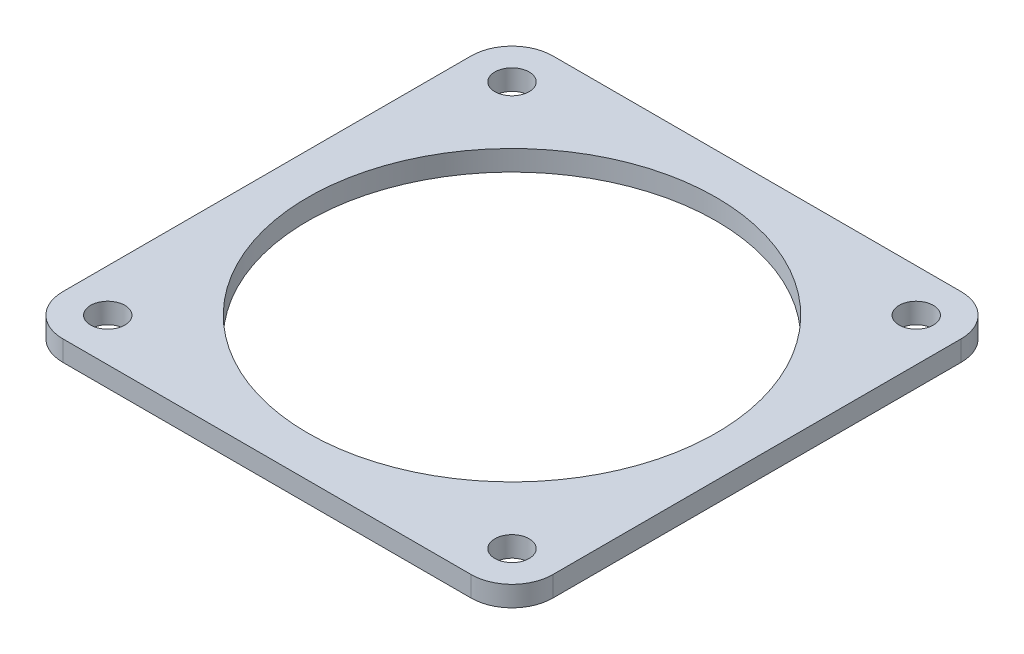
ISO-10303-21;
HEADER;
FILE_DESCRIPTION(('STEP AP214'),'2;1');
FILE_NAME('part.step','',(''),(''),'','','');
FILE_SCHEMA(('AUTOMOTIVE_DESIGN { 1 0 10303 214 1 1 1 1 }'));
ENDSEC;
DATA;
#1=APPLICATION_CONTEXT('core data for automotive mechanical design processes');
#2=APPLICATION_PROTOCOL_DEFINITION('international standard','automotive_design',2000,#1);
#3=PRODUCT_CONTEXT('',#1,'mechanical');
#4=PRODUCT('Part','Part','',(#3));
#5=PRODUCT_RELATED_PRODUCT_CATEGORY('part','',(#4));
#6=PRODUCT_DEFINITION_FORMATION('','',#4);
#7=PRODUCT_DEFINITION_CONTEXT('part definition',#1,'design');
#8=PRODUCT_DEFINITION('design','',#6,#7);
#9=PRODUCT_DEFINITION_SHAPE('','',#8);
#10=(LENGTH_UNIT() NAMED_UNIT(*) SI_UNIT(.MILLI.,.METRE.));
#11=(NAMED_UNIT(*) PLANE_ANGLE_UNIT() SI_UNIT($,.RADIAN.));
#12=(NAMED_UNIT(*) SI_UNIT($,.STERADIAN.) SOLID_ANGLE_UNIT());
#13=UNCERTAINTY_MEASURE_WITH_UNIT(LENGTH_MEASURE(1.E-05),#10,'distance_accuracy_value','');
#14=(GEOMETRIC_REPRESENTATION_CONTEXT(3) GLOBAL_UNCERTAINTY_ASSIGNED_CONTEXT((#13)) GLOBAL_UNIT_ASSIGNED_CONTEXT((#10,
#11,#12)) REPRESENTATION_CONTEXT('',''));
#15=CARTESIAN_POINT('',(0.,0.,0.));
#16=DIRECTION('',(0.,0.,1.));
#17=DIRECTION('',(1.,0.,0.));
#18=AXIS2_PLACEMENT_3D('',#15,#16,#17);
#19=CARTESIAN_POINT('',(0.,3.175,0.));
#20=DIRECTION('',(0.,1.,0.));
#21=DIRECTION('',(0.,0.,1.));
#22=AXIS2_PLACEMENT_3D('',#19,#20,#21);
#23=PLANE('',#22);
#24=CARTESIAN_POINT('',(31.4308964237419,3.175,31.4308964237421));
#25=DIRECTION('',(0.,1.,0.));
#26=DIRECTION('',(-1.,0.,0.));
#27=AXIS2_PLACEMENT_3D('',#24,#25,#26);
#28=CIRCLE('',#27,2.665);
#29=CARTESIAN_POINT('',(28.7658964237419,3.175,31.4308964237421));
#30=VERTEX_POINT('',#29);
#31=EDGE_CURVE('E201',#30,#30,#28,.T.);
#32=ORIENTED_EDGE('',*,*,#31,.F.);
#33=EDGE_LOOP('',(#32));
#34=FACE_BOUND('',#33,.T.);
#35=CARTESIAN_POINT('',(-31.430896423742,3.175,31.430896423742));
#36=DIRECTION('',(0.,1.,0.));
#37=DIRECTION('',(0.,0.,-1.));
#38=AXIS2_PLACEMENT_3D('',#35,#36,#37);
#39=CIRCLE('',#38,2.665);
#40=CARTESIAN_POINT('',(-31.430896423742,3.175,28.765896423742));
#41=VERTEX_POINT('',#40);
#42=EDGE_CURVE('E194',#41,#41,#39,.T.);
#43=ORIENTED_EDGE('',*,*,#42,.F.);
#44=EDGE_LOOP('',(#43));
#45=FACE_BOUND('',#44,.T.);
#46=CARTESIAN_POINT('',(-31.4308964237417,3.175,-31.4308964237424));
#47=DIRECTION('',(0.,1.,0.));
#48=DIRECTION('',(1.,0.,0.));
#49=AXIS2_PLACEMENT_3D('',#46,#47,#48);
#50=CIRCLE('',#49,2.665);
#51=CARTESIAN_POINT('',(-28.7658964237417,3.175,-31.4308964237423));
#52=VERTEX_POINT('',#51);
#53=EDGE_CURVE('E195',#52,#52,#50,.T.);
#54=ORIENTED_EDGE('',*,*,#53,.F.);
#55=EDGE_LOOP('',(#54));
#56=FACE_BOUND('',#55,.T.);
#57=CARTESIAN_POINT('',(31.430896423742,3.175,-31.430896423742));
#58=DIRECTION('',(0.,1.,0.));
#59=DIRECTION('',(0.,0.,1.));
#60=AXIS2_PLACEMENT_3D('',#57,#58,#59);
#61=CIRCLE('',#60,2.665);
#62=CARTESIAN_POINT('',(31.430896423742,3.175,-28.765896423742));
#63=VERTEX_POINT('',#62);
#64=EDGE_CURVE('E187',#63,#63,#61,.T.);
#65=ORIENTED_EDGE('',*,*,#64,.F.);
#66=EDGE_LOOP('',(#65));
#67=FACE_BOUND('',#66,.T.);
#68=DIRECTION('',(-1.,0.,0.));
#69=VECTOR('',#68,1.);
#70=CARTESIAN_POINT('',(-38.1,3.175,-38.1));
#71=LINE('',#70,#69);
#72=CARTESIAN_POINT('',(31.75,3.175,-38.1));
#73=VERTEX_POINT('',#72);
#74=CARTESIAN_POINT('',(-31.75,3.175,-38.1));
#75=VERTEX_POINT('',#74);
#76=EDGE_CURVE('E169',#73,#75,#71,.T.);
#77=ORIENTED_EDGE('',*,*,#76,.T.);
#78=CARTESIAN_POINT('',(-31.75,3.175,-31.75));
#79=DIRECTION('',(0.,1.,0.));
#80=DIRECTION('',(0.,0.,1.));
#81=AXIS2_PLACEMENT_3D('',#78,#79,#80);
#82=CIRCLE('',#81,6.35);
#83=CARTESIAN_POINT('',(-38.1,3.175,-31.75));
#84=VERTEX_POINT('',#83);
#85=EDGE_CURVE('E147',#75,#84,#82,.T.);
#86=ORIENTED_EDGE('',*,*,#85,.T.);
#87=DIRECTION('',(0.,0.,1.));
#88=VECTOR('',#87,1.);
#89=CARTESIAN_POINT('',(-38.1,3.175,-38.1));
#90=LINE('',#89,#88);
#91=CARTESIAN_POINT('',(-38.1,3.175,31.75));
#92=VERTEX_POINT('',#91);
#93=EDGE_CURVE('E117',#84,#92,#90,.T.);
#94=ORIENTED_EDGE('',*,*,#93,.T.);
#95=CARTESIAN_POINT('',(-31.75,3.175,31.75));
#96=DIRECTION('',(0.,1.,0.));
#97=DIRECTION('',(0.,0.,1.));
#98=AXIS2_PLACEMENT_3D('',#95,#96,#97);
#99=CIRCLE('',#98,6.35);
#100=CARTESIAN_POINT('',(-31.75,3.175,38.1));
#101=VERTEX_POINT('',#100);
#102=EDGE_CURVE('E53',#92,#101,#99,.T.);
#103=ORIENTED_EDGE('',*,*,#102,.T.);
#104=DIRECTION('',(1.,0.,0.));
#105=VECTOR('',#104,1.);
#106=CARTESIAN_POINT('',(-38.1,3.175,38.1));
#107=LINE('',#106,#105);
#108=CARTESIAN_POINT('',(31.75,3.175,38.1));
#109=VERTEX_POINT('',#108);
#110=EDGE_CURVE('E133',#101,#109,#107,.T.);
#111=ORIENTED_EDGE('',*,*,#110,.T.);
#112=CARTESIAN_POINT('',(31.75,3.175,31.75));
#113=DIRECTION('',(0.,1.,0.));
#114=DIRECTION('',(0.,0.,1.));
#115=AXIS2_PLACEMENT_3D('',#112,#113,#114);
#116=CIRCLE('',#115,6.35);
#117=CARTESIAN_POINT('',(38.1,3.175,31.75));
#118=VERTEX_POINT('',#117);
#119=EDGE_CURVE('E143',#109,#118,#116,.T.);
#120=ORIENTED_EDGE('',*,*,#119,.T.);
#121=DIRECTION('',(0.,0.,-1.));
#122=VECTOR('',#121,1.);
#123=CARTESIAN_POINT('',(38.1,3.175,-38.1));
#124=LINE('',#123,#122);
#125=CARTESIAN_POINT('',(38.1,3.175,-31.75));
#126=VERTEX_POINT('',#125);
#127=EDGE_CURVE('E127',#118,#126,#124,.T.);
#128=ORIENTED_EDGE('',*,*,#127,.T.);
#129=CARTESIAN_POINT('',(31.75,3.175,-31.75));
#130=DIRECTION('',(0.,1.,0.));
#131=DIRECTION('',(0.,0.,1.));
#132=AXIS2_PLACEMENT_3D('',#129,#130,#131);
#133=CIRCLE('',#132,6.35);
#134=EDGE_CURVE('E145',#126,#73,#133,.T.);
#135=ORIENTED_EDGE('',*,*,#134,.T.);
#136=EDGE_LOOP('',(#77,#86,#94,#103,#111,#120,#128,#135));
#137=FACE_BOUND('',#136,.T.);
#138=CARTESIAN_POINT('',(0.,3.175,0.));
#139=DIRECTION('',(0.,1.,0.));
#140=DIRECTION('',(0.,0.,1.));
#141=AXIS2_PLACEMENT_3D('',#138,#139,#140);
#142=CIRCLE('',#141,31.75);
#143=CARTESIAN_POINT('',(0.,3.175,31.75));
#144=VERTEX_POINT('',#143);
#145=EDGE_CURVE('E178',#144,#144,#142,.T.);
#146=ORIENTED_EDGE('',*,*,#145,.F.);
#147=EDGE_LOOP('',(#146));
#148=FACE_BOUND('',#147,.T.);
#149=ADVANCED_FACE('F33',(#34,#45,#56,#67,#137,#148),#23,.T.);
#150=CARTESIAN_POINT('',(0.,0.,0.));
#151=DIRECTION('',(0.,1.,0.));
#152=DIRECTION('',(0.,0.,1.));
#153=AXIS2_PLACEMENT_3D('',#150,#151,#152);
#154=PLANE('',#153);
#155=CARTESIAN_POINT('',(31.4308964237419,0.,31.4308964237421));
#156=DIRECTION('',(0.,1.,0.));
#157=DIRECTION('',(0.,0.,1.));
#158=AXIS2_PLACEMENT_3D('',#155,#156,#157);
#159=CIRCLE('',#158,2.665);
#160=CARTESIAN_POINT('',(31.4308964237419,0.,34.0958964237421));
#161=VERTEX_POINT('',#160);
#162=EDGE_CURVE('E190',#161,#161,#159,.F.);
#163=ORIENTED_EDGE('',*,*,#162,.F.);
#164=EDGE_LOOP('',(#163));
#165=FACE_BOUND('',#164,.T.);
#166=CARTESIAN_POINT('',(-31.430896423742,0.,31.430896423742));
#167=DIRECTION('',(0.,1.,0.));
#168=DIRECTION('',(0.,0.,1.));
#169=AXIS2_PLACEMENT_3D('',#166,#167,#168);
#170=CIRCLE('',#169,2.665);
#171=CARTESIAN_POINT('',(-31.430896423742,0.,34.095896423742));
#172=VERTEX_POINT('',#171);
#173=EDGE_CURVE('E198',#172,#172,#170,.F.);
#174=ORIENTED_EDGE('',*,*,#173,.F.);
#175=EDGE_LOOP('',(#174));
#176=FACE_BOUND('',#175,.T.);
#177=CARTESIAN_POINT('',(-31.4308964237417,0.,-31.4308964237424));
#178=DIRECTION('',(0.,1.,0.));
#179=DIRECTION('',(0.,0.,1.));
#180=AXIS2_PLACEMENT_3D('',#177,#178,#179);
#181=CIRCLE('',#180,2.665);
#182=CARTESIAN_POINT('',(-31.4308964237417,0.,-28.7658964237424));
#183=VERTEX_POINT('',#182);
#184=EDGE_CURVE('E191',#183,#183,#181,.F.);
#185=ORIENTED_EDGE('',*,*,#184,.F.);
#186=EDGE_LOOP('',(#185));
#187=FACE_BOUND('',#186,.T.);
#188=CARTESIAN_POINT('',(31.430896423742,0.,-31.430896423742));
#189=DIRECTION('',(0.,1.,0.));
#190=DIRECTION('',(0.,0.,1.));
#191=AXIS2_PLACEMENT_3D('',#188,#189,#190);
#192=CIRCLE('',#191,2.665);
#193=CARTESIAN_POINT('',(31.430896423742,0.,-28.765896423742));
#194=VERTEX_POINT('',#193);
#195=EDGE_CURVE('E183',#194,#194,#192,.F.);
#196=ORIENTED_EDGE('',*,*,#195,.F.);
#197=EDGE_LOOP('',(#196));
#198=FACE_BOUND('',#197,.T.);
#199=DIRECTION('',(0.,0.,1.));
#200=VECTOR('',#199,1.);
#201=CARTESIAN_POINT('',(-38.1,0.,-38.1));
#202=LINE('',#201,#200);
#203=CARTESIAN_POINT('',(-38.1,0.,-31.75));
#204=VERTEX_POINT('',#203);
#205=CARTESIAN_POINT('',(-38.1,0.,31.75));
#206=VERTEX_POINT('',#205);
#207=EDGE_CURVE('E115',#204,#206,#202,.T.);
#208=ORIENTED_EDGE('',*,*,#207,.F.);
#209=CARTESIAN_POINT('',(-31.75,0.,-31.75));
#210=DIRECTION('',(0.,1.,0.));
#211=DIRECTION('',(0.,0.,1.));
#212=AXIS2_PLACEMENT_3D('',#209,#210,#211);
#213=CIRCLE('',#212,6.35);
#214=CARTESIAN_POINT('',(-31.75,0.,-38.1));
#215=VERTEX_POINT('',#214);
#216=EDGE_CURVE('E98',#204,#215,#213,.F.);
#217=ORIENTED_EDGE('',*,*,#216,.T.);
#218=DIRECTION('',(-1.,0.,0.));
#219=VECTOR('',#218,1.);
#220=CARTESIAN_POINT('',(-38.1,0.,-38.1));
#221=LINE('',#220,#219);
#222=CARTESIAN_POINT('',(31.75,0.,-38.1));
#223=VERTEX_POINT('',#222);
#224=EDGE_CURVE('E125',#223,#215,#221,.T.);
#225=ORIENTED_EDGE('',*,*,#224,.F.);
#226=CARTESIAN_POINT('',(31.75,0.,-31.75));
#227=DIRECTION('',(0.,1.,0.));
#228=DIRECTION('',(0.,0.,1.));
#229=AXIS2_PLACEMENT_3D('',#226,#227,#228);
#230=CIRCLE('',#229,6.35);
#231=CARTESIAN_POINT('',(38.1,0.,-31.75));
#232=VERTEX_POINT('',#231);
#233=EDGE_CURVE('E109',#223,#232,#230,.F.);
#234=ORIENTED_EDGE('',*,*,#233,.T.);
#235=DIRECTION('',(0.,0.,-1.));
#236=VECTOR('',#235,1.);
#237=CARTESIAN_POINT('',(38.1,0.,-38.1));
#238=LINE('',#237,#236);
#239=CARTESIAN_POINT('',(38.1,0.,31.75));
#240=VERTEX_POINT('',#239);
#241=EDGE_CURVE('E129',#240,#232,#238,.T.);
#242=ORIENTED_EDGE('',*,*,#241,.F.);
#243=CARTESIAN_POINT('',(31.75,0.,31.75));
#244=DIRECTION('',(0.,1.,0.));
#245=DIRECTION('',(0.,0.,1.));
#246=AXIS2_PLACEMENT_3D('',#243,#244,#245);
#247=CIRCLE('',#246,6.35);
#248=CARTESIAN_POINT('',(31.75,0.,38.1));
#249=VERTEX_POINT('',#248);
#250=EDGE_CURVE('E136',#240,#249,#247,.F.);
#251=ORIENTED_EDGE('',*,*,#250,.T.);
#252=DIRECTION('',(1.,0.,0.));
#253=VECTOR('',#252,1.);
#254=CARTESIAN_POINT('',(-38.1,0.,38.1));
#255=LINE('',#254,#253);
#256=CARTESIAN_POINT('',(-31.75,0.,38.1));
#257=VERTEX_POINT('',#256);
#258=EDGE_CURVE('E124',#257,#249,#255,.T.);
#259=ORIENTED_EDGE('',*,*,#258,.F.);
#260=CARTESIAN_POINT('',(-31.75,0.,31.75));
#261=DIRECTION('',(0.,1.,0.));
#262=DIRECTION('',(0.,0.,1.));
#263=AXIS2_PLACEMENT_3D('',#260,#261,#262);
#264=CIRCLE('',#263,6.35);
#265=EDGE_CURVE('E118',#257,#206,#264,.F.);
#266=ORIENTED_EDGE('',*,*,#265,.T.);
#267=EDGE_LOOP('',(#208,#217,#225,#234,#242,#251,#259,#266));
#268=FACE_BOUND('',#267,.T.);
#269=CARTESIAN_POINT('',(0.,0.,0.));
#270=DIRECTION('',(0.,1.,0.));
#271=DIRECTION('',(0.,0.,1.));
#272=AXIS2_PLACEMENT_3D('',#269,#270,#271);
#273=CIRCLE('',#272,31.75);
#274=CARTESIAN_POINT('',(0.,0.,31.75));
#275=VERTEX_POINT('',#274);
#276=EDGE_CURVE('E174',#275,#275,#273,.T.);
#277=ORIENTED_EDGE('',*,*,#276,.T.);
#278=EDGE_LOOP('',(#277));
#279=FACE_BOUND('',#278,.T.);
#280=ADVANCED_FACE('F121',(#165,#176,#187,#198,#268,#279),#154,.F.);
#281=CARTESIAN_POINT('',(38.1,3.175,-38.1));
#282=DIRECTION('',(-1.,0.,0.));
#283=DIRECTION('',(0.,0.,1.));
#284=AXIS2_PLACEMENT_3D('',#281,#282,#283);
#285=PLANE('',#284);
#286=ORIENTED_EDGE('',*,*,#241,.T.);
#287=DIRECTION('',(0.,-1.,0.));
#288=VECTOR('',#287,1.);
#289=CARTESIAN_POINT('',(38.1,3.175,-31.75));
#290=LINE('',#289,#288);
#291=EDGE_CURVE('E152',#232,#126,#290,.F.);
#292=ORIENTED_EDGE('',*,*,#291,.T.);
#293=ORIENTED_EDGE('',*,*,#127,.F.);
#294=DIRECTION('',(0.,-1.,0.));
#295=VECTOR('',#294,1.);
#296=CARTESIAN_POINT('',(38.1,3.175,31.75));
#297=LINE('',#296,#295);
#298=EDGE_CURVE('E149',#118,#240,#297,.T.);
#299=ORIENTED_EDGE('',*,*,#298,.T.);
#300=EDGE_LOOP('',(#286,#292,#293,#299));
#301=FACE_BOUND('',#300,.T.);
#302=ADVANCED_FACE('F165',(#301),#285,.F.);
#303=CARTESIAN_POINT('',(-38.1,3.175,-38.1));
#304=DIRECTION('',(0.,0.,1.));
#305=DIRECTION('',(1.,0.,0.));
#306=AXIS2_PLACEMENT_3D('',#303,#304,#305);
#307=PLANE('',#306);
#308=ORIENTED_EDGE('',*,*,#224,.T.);
#309=DIRECTION('',(0.,-1.,0.));
#310=VECTOR('',#309,1.);
#311=CARTESIAN_POINT('',(-31.75,3.175,-38.1));
#312=LINE('',#311,#310);
#313=EDGE_CURVE('E103',#215,#75,#312,.F.);
#314=ORIENTED_EDGE('',*,*,#313,.T.);
#315=ORIENTED_EDGE('',*,*,#76,.F.);
#316=DIRECTION('',(0.,-1.,0.));
#317=VECTOR('',#316,1.);
#318=CARTESIAN_POINT('',(31.75,3.175,-38.1));
#319=LINE('',#318,#317);
#320=EDGE_CURVE('E108',#73,#223,#319,.T.);
#321=ORIENTED_EDGE('',*,*,#320,.T.);
#322=EDGE_LOOP('',(#308,#314,#315,#321));
#323=FACE_BOUND('',#322,.T.);
#324=ADVANCED_FACE('F224',(#323),#307,.F.);
#325=CARTESIAN_POINT('',(-38.1,3.175,-38.1));
#326=DIRECTION('',(1.,0.,0.));
#327=DIRECTION('',(0.,0.,-1.));
#328=AXIS2_PLACEMENT_3D('',#325,#326,#327);
#329=PLANE('',#328);
#330=ORIENTED_EDGE('',*,*,#93,.F.);
#331=DIRECTION('',(0.,-1.,0.));
#332=VECTOR('',#331,1.);
#333=CARTESIAN_POINT('',(-38.1,3.175,-31.75));
#334=LINE('',#333,#332);
#335=EDGE_CURVE('E102',#84,#204,#334,.T.);
#336=ORIENTED_EDGE('',*,*,#335,.T.);
#337=ORIENTED_EDGE('',*,*,#207,.T.);
#338=DIRECTION('',(0.,-1.,0.));
#339=VECTOR('',#338,1.);
#340=CARTESIAN_POINT('',(-38.1,3.175,31.75));
#341=LINE('',#340,#339);
#342=EDGE_CURVE('E119',#206,#92,#341,.F.);
#343=ORIENTED_EDGE('',*,*,#342,.T.);
#344=EDGE_LOOP('',(#330,#336,#337,#343));
#345=FACE_BOUND('',#344,.T.);
#346=ADVANCED_FACE('F114',(#345),#329,.F.);
#347=CARTESIAN_POINT('',(-38.1,3.175,38.1));
#348=DIRECTION('',(0.,0.,-1.));
#349=DIRECTION('',(-1.,0.,0.));
#350=AXIS2_PLACEMENT_3D('',#347,#348,#349);
#351=PLANE('',#350);
#352=ORIENTED_EDGE('',*,*,#258,.T.);
#353=DIRECTION('',(0.,-1.,0.));
#354=VECTOR('',#353,1.);
#355=CARTESIAN_POINT('',(31.75,3.175,38.1));
#356=LINE('',#355,#354);
#357=EDGE_CURVE('E11',#249,#109,#356,.F.);
#358=ORIENTED_EDGE('',*,*,#357,.T.);
#359=ORIENTED_EDGE('',*,*,#110,.F.);
#360=DIRECTION('',(0.,-1.,0.));
#361=VECTOR('',#360,1.);
#362=CARTESIAN_POINT('',(-31.75,3.175,38.1));
#363=LINE('',#362,#361);
#364=EDGE_CURVE('E41',#101,#257,#363,.T.);
#365=ORIENTED_EDGE('',*,*,#364,.T.);
#366=EDGE_LOOP('',(#352,#358,#359,#365));
#367=FACE_BOUND('',#366,.T.);
#368=ADVANCED_FACE('F155',(#367),#351,.F.);
#369=CARTESIAN_POINT('',(0.,3.175,0.));
#370=DIRECTION('',(0.,-1.,0.));
#371=DIRECTION('',(0.,0.,-1.));
#372=AXIS2_PLACEMENT_3D('',#369,#370,#371);
#373=CYLINDRICAL_SURFACE('',#372,31.75);
#374=ORIENTED_EDGE('',*,*,#145,.T.);
#375=EDGE_LOOP('',(#374));
#376=FACE_BOUND('',#375,.T.);
#377=ORIENTED_EDGE('',*,*,#276,.F.);
#378=EDGE_LOOP('',(#377));
#379=FACE_BOUND('',#378,.T.);
#380=ADVANCED_FACE('F243',(#376,#379),#373,.F.);
#381=CARTESIAN_POINT('',(31.430896423742,-0.00100000000000013,-31.430896423742));
#382=DIRECTION('',(0.,1.,0.));
#383=DIRECTION('',(0.,0.,1.));
#384=AXIS2_PLACEMENT_3D('',#381,#382,#383);
#385=CYLINDRICAL_SURFACE('',#384,2.665);
#386=ORIENTED_EDGE('',*,*,#64,.T.);
#387=EDGE_LOOP('',(#386));
#388=FACE_BOUND('',#387,.T.);
#389=ORIENTED_EDGE('',*,*,#195,.T.);
#390=EDGE_LOOP('',(#389));
#391=FACE_BOUND('',#390,.T.);
#392=ADVANCED_FACE('F249',(#388,#391),#385,.F.);
#393=CARTESIAN_POINT('',(-31.4308964237417,-0.00100000000000013,-31.4308964237424));
#394=DIRECTION('',(0.,1.,0.));
#395=DIRECTION('',(0.,0.,1.));
#396=AXIS2_PLACEMENT_3D('',#393,#394,#395);
#397=CYLINDRICAL_SURFACE('',#396,2.665);
#398=ORIENTED_EDGE('',*,*,#53,.T.);
#399=EDGE_LOOP('',(#398));
#400=FACE_BOUND('',#399,.T.);
#401=ORIENTED_EDGE('',*,*,#184,.T.);
#402=EDGE_LOOP('',(#401));
#403=FACE_BOUND('',#402,.T.);
#404=ADVANCED_FACE('F252',(#400,#403),#397,.F.);
#405=CARTESIAN_POINT('',(-31.430896423742,-0.00100000000000013,31.430896423742));
#406=DIRECTION('',(0.,1.,0.));
#407=DIRECTION('',(0.,0.,1.));
#408=AXIS2_PLACEMENT_3D('',#405,#406,#407);
#409=CYLINDRICAL_SURFACE('',#408,2.665);
#410=ORIENTED_EDGE('',*,*,#42,.T.);
#411=EDGE_LOOP('',(#410));
#412=FACE_BOUND('',#411,.T.);
#413=ORIENTED_EDGE('',*,*,#173,.T.);
#414=EDGE_LOOP('',(#413));
#415=FACE_BOUND('',#414,.T.);
#416=ADVANCED_FACE('F256',(#412,#415),#409,.F.);
#417=CARTESIAN_POINT('',(31.4308964237419,-0.00100000000000013,31.4308964237421));
#418=DIRECTION('',(0.,1.,0.));
#419=DIRECTION('',(0.,0.,1.));
#420=AXIS2_PLACEMENT_3D('',#417,#418,#419);
#421=CYLINDRICAL_SURFACE('',#420,2.665);
#422=ORIENTED_EDGE('',*,*,#31,.T.);
#423=EDGE_LOOP('',(#422));
#424=FACE_BOUND('',#423,.T.);
#425=ORIENTED_EDGE('',*,*,#162,.T.);
#426=EDGE_LOOP('',(#425));
#427=FACE_BOUND('',#426,.T.);
#428=ADVANCED_FACE('F209',(#424,#427),#421,.F.);
#429=CARTESIAN_POINT('',(-31.75,3.175,-31.75));
#430=DIRECTION('',(0.,-1.,0.));
#431=DIRECTION('',(0.,0.,-1.));
#432=AXIS2_PLACEMENT_3D('',#429,#430,#431);
#433=CYLINDRICAL_SURFACE('',#432,6.35);
#434=ORIENTED_EDGE('',*,*,#85,.F.);
#435=ORIENTED_EDGE('',*,*,#313,.F.);
#436=ORIENTED_EDGE('',*,*,#216,.F.);
#437=ORIENTED_EDGE('',*,*,#335,.F.);
#438=EDGE_LOOP('',(#434,#435,#436,#437));
#439=FACE_BOUND('',#438,.T.);
#440=ADVANCED_FACE('F101',(#439),#433,.T.);
#441=CARTESIAN_POINT('',(31.75,3.175,-31.75));
#442=DIRECTION('',(0.,-1.,0.));
#443=DIRECTION('',(0.,0.,-1.));
#444=AXIS2_PLACEMENT_3D('',#441,#442,#443);
#445=CYLINDRICAL_SURFACE('',#444,6.35);
#446=ORIENTED_EDGE('',*,*,#134,.F.);
#447=ORIENTED_EDGE('',*,*,#291,.F.);
#448=ORIENTED_EDGE('',*,*,#233,.F.);
#449=ORIENTED_EDGE('',*,*,#320,.F.);
#450=EDGE_LOOP('',(#446,#447,#448,#449));
#451=FACE_BOUND('',#450,.T.);
#452=ADVANCED_FACE('F226',(#451),#445,.T.);
#453=CARTESIAN_POINT('',(31.75,3.175,31.75));
#454=DIRECTION('',(0.,-1.,0.));
#455=DIRECTION('',(0.,0.,-1.));
#456=AXIS2_PLACEMENT_3D('',#453,#454,#455);
#457=CYLINDRICAL_SURFACE('',#456,6.35);
#458=ORIENTED_EDGE('',*,*,#119,.F.);
#459=ORIENTED_EDGE('',*,*,#357,.F.);
#460=ORIENTED_EDGE('',*,*,#250,.F.);
#461=ORIENTED_EDGE('',*,*,#298,.F.);
#462=EDGE_LOOP('',(#458,#459,#460,#461));
#463=FACE_BOUND('',#462,.T.);
#464=ADVANCED_FACE('F162',(#463),#457,.T.);
#465=CARTESIAN_POINT('',(-31.75,3.175,31.75));
#466=DIRECTION('',(0.,-1.,0.));
#467=DIRECTION('',(0.,0.,-1.));
#468=AXIS2_PLACEMENT_3D('',#465,#466,#467);
#469=CYLINDRICAL_SURFACE('',#468,6.35);
#470=ORIENTED_EDGE('',*,*,#102,.F.);
#471=ORIENTED_EDGE('',*,*,#342,.F.);
#472=ORIENTED_EDGE('',*,*,#265,.F.);
#473=ORIENTED_EDGE('',*,*,#364,.F.);
#474=EDGE_LOOP('',(#470,#471,#472,#473));
#475=FACE_BOUND('',#474,.T.);
#476=ADVANCED_FACE('F35',(#475),#469,.T.);
#477=CLOSED_SHELL('',(#149,#280,#302,#324,#346,#368,#380,#392,#404,#416,#428,#440,#452,#464,#476));
#478=MANIFOLD_SOLID_BREP('B2',#477);
#479=ADVANCED_BREP_SHAPE_REPRESENTATION('',(#18,#478),#14);
#480=SHAPE_DEFINITION_REPRESENTATION(#9,#479);
ENDSEC;
END-ISO-10303-21;
